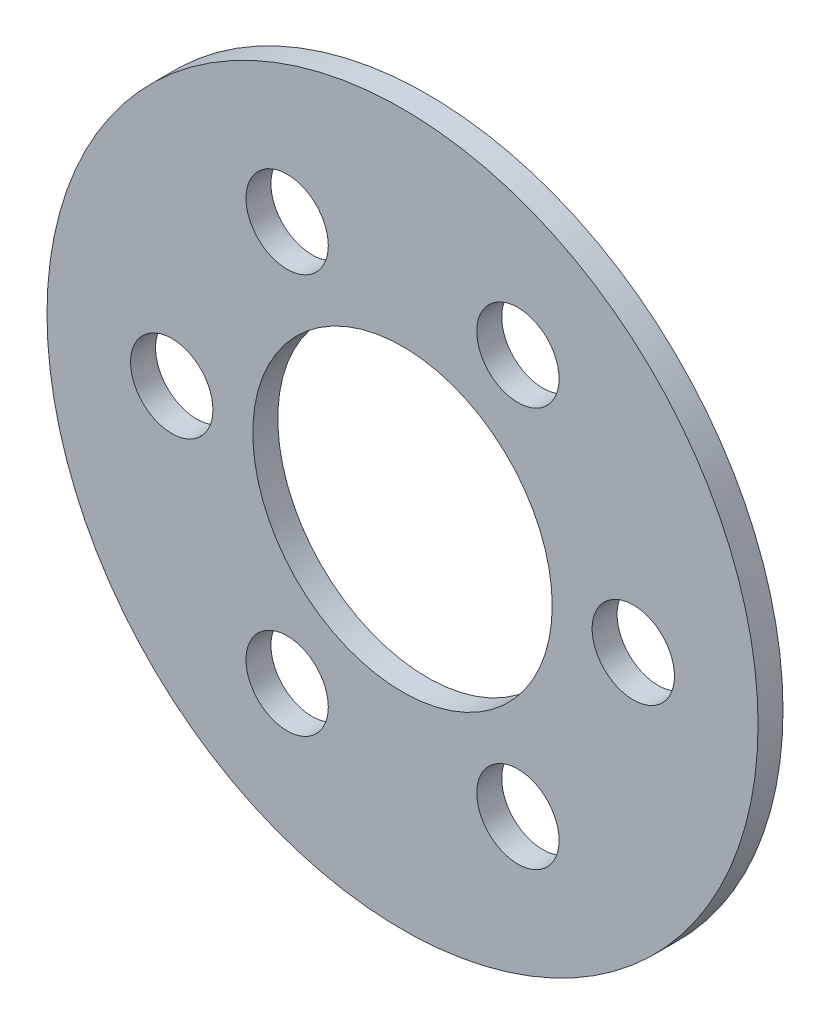
ISO-10303-21;
HEADER;
FILE_DESCRIPTION(('STEP AP214'),'2;1');
FILE_NAME('part.step','',(''),(''),'','','');
FILE_SCHEMA(('AUTOMOTIVE_DESIGN { 1 0 10303 214 1 1 1 1 }'));
ENDSEC;
DATA;
#1=APPLICATION_CONTEXT('core data for automotive mechanical design processes');
#2=APPLICATION_PROTOCOL_DEFINITION('international standard','automotive_design',2000,#1);
#3=PRODUCT_CONTEXT('',#1,'mechanical');
#4=PRODUCT('Part','Part','',(#3));
#5=PRODUCT_RELATED_PRODUCT_CATEGORY('part','',(#4));
#6=PRODUCT_DEFINITION_FORMATION('','',#4);
#7=PRODUCT_DEFINITION_CONTEXT('part definition',#1,'design');
#8=PRODUCT_DEFINITION('design','',#6,#7);
#9=PRODUCT_DEFINITION_SHAPE('','',#8);
#10=(LENGTH_UNIT() NAMED_UNIT(*) SI_UNIT(.MILLI.,.METRE.));
#11=(NAMED_UNIT(*) PLANE_ANGLE_UNIT() SI_UNIT($,.RADIAN.));
#12=(NAMED_UNIT(*) SI_UNIT($,.STERADIAN.) SOLID_ANGLE_UNIT());
#13=UNCERTAINTY_MEASURE_WITH_UNIT(LENGTH_MEASURE(1.E-05),#10,'distance_accuracy_value','');
#14=(GEOMETRIC_REPRESENTATION_CONTEXT(3) GLOBAL_UNCERTAINTY_ASSIGNED_CONTEXT((#13)) GLOBAL_UNIT_ASSIGNED_CONTEXT((#10,
#11,#12)) REPRESENTATION_CONTEXT('',''));
#15=CARTESIAN_POINT('',(0.,0.,0.));
#16=DIRECTION('',(0.,0.,1.));
#17=DIRECTION('',(1.,0.,0.));
#18=AXIS2_PLACEMENT_3D('',#15,#16,#17);
#19=CARTESIAN_POINT('',(0.,0.,1.));
#20=DIRECTION('',(0.,0.,-1.));
#21=DIRECTION('',(-1.,0.,0.));
#22=AXIS2_PLACEMENT_3D('',#19,#20,#21);
#23=CYLINDRICAL_SURFACE('',#22,6.);
#24=CARTESIAN_POINT('',(0.,0.,1.));
#25=DIRECTION('',(0.,0.,1.));
#26=DIRECTION('',(1.,0.,0.));
#27=AXIS2_PLACEMENT_3D('',#24,#25,#26);
#28=CIRCLE('',#27,6.);
#29=CARTESIAN_POINT('',(6.,0.,1.));
#30=VERTEX_POINT('',#29);
#31=EDGE_CURVE('E47',#30,#30,#28,.T.);
#32=ORIENTED_EDGE('',*,*,#31,.T.);
#33=EDGE_LOOP('',(#32));
#34=FACE_BOUND('',#33,.T.);
#35=CARTESIAN_POINT('',(0.,0.,0.));
#36=DIRECTION('',(0.,0.,1.));
#37=DIRECTION('',(1.,0.,0.));
#38=AXIS2_PLACEMENT_3D('',#35,#36,#37);
#39=CIRCLE('',#38,6.);
#40=CARTESIAN_POINT('',(6.,0.,0.));
#41=VERTEX_POINT('',#40);
#42=EDGE_CURVE('E73',#41,#41,#39,.T.);
#43=ORIENTED_EDGE('',*,*,#42,.F.);
#44=EDGE_LOOP('',(#43));
#45=FACE_BOUND('',#44,.T.);
#46=ADVANCED_FACE('F39',(#34,#45),#23,.F.);
#47=CARTESIAN_POINT('',(-4.625,8.01073498500606,1.));
#48=DIRECTION('',(0.,0.,-1.));
#49=DIRECTION('',(-1.,0.,0.));
#50=AXIS2_PLACEMENT_3D('',#47,#48,#49);
#51=CYLINDRICAL_SURFACE('',#50,1.65);
#52=CARTESIAN_POINT('',(-4.625,8.01073498500606,1.));
#53=DIRECTION('',(0.,0.,1.));
#54=DIRECTION('',(1.,0.,0.));
#55=AXIS2_PLACEMENT_3D('',#52,#53,#54);
#56=CIRCLE('',#55,1.65);
#57=CARTESIAN_POINT('',(-2.975,8.01073498500606,1.));
#58=VERTEX_POINT('',#57);
#59=EDGE_CURVE('E52',#58,#58,#56,.T.);
#60=ORIENTED_EDGE('',*,*,#59,.T.);
#61=EDGE_LOOP('',(#60));
#62=FACE_BOUND('',#61,.T.);
#63=CARTESIAN_POINT('',(-4.625,8.01073498500606,0.));
#64=DIRECTION('',(0.,0.,1.));
#65=DIRECTION('',(1.,0.,0.));
#66=AXIS2_PLACEMENT_3D('',#63,#64,#65);
#67=CIRCLE('',#66,1.65);
#68=CARTESIAN_POINT('',(-2.975,8.01073498500606,0.));
#69=VERTEX_POINT('',#68);
#70=EDGE_CURVE('E71',#69,#69,#67,.T.);
#71=ORIENTED_EDGE('',*,*,#70,.F.);
#72=EDGE_LOOP('',(#71));
#73=FACE_BOUND('',#72,.T.);
#74=ADVANCED_FACE('F100',(#62,#73),#51,.F.);
#75=CARTESIAN_POINT('',(4.625,8.01073498500606,1.));
#76=DIRECTION('',(0.,0.,-1.));
#77=DIRECTION('',(-1.,0.,0.));
#78=AXIS2_PLACEMENT_3D('',#75,#76,#77);
#79=CYLINDRICAL_SURFACE('',#78,1.65);
#80=CARTESIAN_POINT('',(4.625,8.01073498500606,1.));
#81=DIRECTION('',(0.,0.,1.));
#82=DIRECTION('',(1.,0.,0.));
#83=AXIS2_PLACEMENT_3D('',#80,#81,#82);
#84=CIRCLE('',#83,1.65);
#85=CARTESIAN_POINT('',(6.275,8.01073498500606,1.));
#86=VERTEX_POINT('',#85);
#87=EDGE_CURVE('E95',#86,#86,#84,.T.);
#88=ORIENTED_EDGE('',*,*,#87,.T.);
#89=EDGE_LOOP('',(#88));
#90=FACE_BOUND('',#89,.T.);
#91=CARTESIAN_POINT('',(4.625,8.01073498500606,0.));
#92=DIRECTION('',(0.,0.,1.));
#93=DIRECTION('',(1.,0.,0.));
#94=AXIS2_PLACEMENT_3D('',#91,#92,#93);
#95=CIRCLE('',#94,1.65);
#96=CARTESIAN_POINT('',(6.275,8.01073498500606,0.));
#97=VERTEX_POINT('',#96);
#98=EDGE_CURVE('E68',#97,#97,#95,.T.);
#99=ORIENTED_EDGE('',*,*,#98,.F.);
#100=EDGE_LOOP('',(#99));
#101=FACE_BOUND('',#100,.T.);
#102=ADVANCED_FACE('F118',(#90,#101),#79,.F.);
#103=CARTESIAN_POINT('',(9.25,0.,1.));
#104=DIRECTION('',(0.,0.,-1.));
#105=DIRECTION('',(-1.,0.,0.));
#106=AXIS2_PLACEMENT_3D('',#103,#104,#105);
#107=CYLINDRICAL_SURFACE('',#106,1.65);
#108=CARTESIAN_POINT('',(9.25,0.,1.));
#109=DIRECTION('',(0.,0.,1.));
#110=DIRECTION('',(1.,0.,0.));
#111=AXIS2_PLACEMENT_3D('',#108,#109,#110);
#112=CIRCLE('',#111,1.65);
#113=CARTESIAN_POINT('',(10.9,0.,1.));
#114=VERTEX_POINT('',#113);
#115=EDGE_CURVE('E92',#114,#114,#112,.T.);
#116=ORIENTED_EDGE('',*,*,#115,.T.);
#117=EDGE_LOOP('',(#116));
#118=FACE_BOUND('',#117,.T.);
#119=CARTESIAN_POINT('',(9.25,0.,0.));
#120=DIRECTION('',(0.,0.,1.));
#121=DIRECTION('',(1.,0.,0.));
#122=AXIS2_PLACEMENT_3D('',#119,#120,#121);
#123=CIRCLE('',#122,1.65);
#124=CARTESIAN_POINT('',(10.9,0.,0.));
#125=VERTEX_POINT('',#124);
#126=EDGE_CURVE('E65',#125,#125,#123,.T.);
#127=ORIENTED_EDGE('',*,*,#126,.F.);
#128=EDGE_LOOP('',(#127));
#129=FACE_BOUND('',#128,.T.);
#130=ADVANCED_FACE('F125',(#118,#129),#107,.F.);
#131=CARTESIAN_POINT('',(4.62500000000001,-8.01073498500606,1.));
#132=DIRECTION('',(0.,0.,-1.));
#133=DIRECTION('',(-1.,0.,0.));
#134=AXIS2_PLACEMENT_3D('',#131,#132,#133);
#135=CYLINDRICAL_SURFACE('',#134,1.65);
#136=CARTESIAN_POINT('',(4.62500000000001,-8.01073498500606,1.));
#137=DIRECTION('',(0.,0.,1.));
#138=DIRECTION('',(1.,0.,0.));
#139=AXIS2_PLACEMENT_3D('',#136,#137,#138);
#140=CIRCLE('',#139,1.65);
#141=CARTESIAN_POINT('',(6.27500000000001,-8.01073498500606,1.));
#142=VERTEX_POINT('',#141);
#143=EDGE_CURVE('E87',#142,#142,#140,.T.);
#144=ORIENTED_EDGE('',*,*,#143,.T.);
#145=EDGE_LOOP('',(#144));
#146=FACE_BOUND('',#145,.T.);
#147=CARTESIAN_POINT('',(4.62500000000001,-8.01073498500606,0.));
#148=DIRECTION('',(0.,0.,1.));
#149=DIRECTION('',(1.,0.,0.));
#150=AXIS2_PLACEMENT_3D('',#147,#148,#149);
#151=CIRCLE('',#150,1.65);
#152=CARTESIAN_POINT('',(6.27500000000001,-8.01073498500606,0.));
#153=VERTEX_POINT('',#152);
#154=EDGE_CURVE('E62',#153,#153,#151,.T.);
#155=ORIENTED_EDGE('',*,*,#154,.F.);
#156=EDGE_LOOP('',(#155));
#157=FACE_BOUND('',#156,.T.);
#158=ADVANCED_FACE('F129',(#146,#157),#135,.F.);
#159=CARTESIAN_POINT('',(-4.625,-8.01073498500606,1.));
#160=DIRECTION('',(0.,0.,-1.));
#161=DIRECTION('',(-1.,0.,0.));
#162=AXIS2_PLACEMENT_3D('',#159,#160,#161);
#163=CYLINDRICAL_SURFACE('',#162,1.65);
#164=CARTESIAN_POINT('',(-4.625,-8.01073498500606,1.));
#165=DIRECTION('',(0.,0.,1.));
#166=DIRECTION('',(1.,0.,0.));
#167=AXIS2_PLACEMENT_3D('',#164,#165,#166);
#168=CIRCLE('',#167,1.65);
#169=CARTESIAN_POINT('',(-2.975,-8.01073498500606,1.));
#170=VERTEX_POINT('',#169);
#171=EDGE_CURVE('E82',#170,#170,#168,.T.);
#172=ORIENTED_EDGE('',*,*,#171,.T.);
#173=EDGE_LOOP('',(#172));
#174=FACE_BOUND('',#173,.T.);
#175=CARTESIAN_POINT('',(-4.625,-8.01073498500606,0.));
#176=DIRECTION('',(0.,0.,1.));
#177=DIRECTION('',(1.,0.,0.));
#178=AXIS2_PLACEMENT_3D('',#175,#176,#177);
#179=CIRCLE('',#178,1.65);
#180=CARTESIAN_POINT('',(-2.975,-8.01073498500606,0.));
#181=VERTEX_POINT('',#180);
#182=EDGE_CURVE('E59',#181,#181,#179,.T.);
#183=ORIENTED_EDGE('',*,*,#182,.F.);
#184=EDGE_LOOP('',(#183));
#185=FACE_BOUND('',#184,.T.);
#186=ADVANCED_FACE('F132',(#174,#185),#163,.F.);
#187=CARTESIAN_POINT('',(-9.25,0.,1.));
#188=DIRECTION('',(0.,0.,-1.));
#189=DIRECTION('',(-1.,0.,0.));
#190=AXIS2_PLACEMENT_3D('',#187,#188,#189);
#191=CYLINDRICAL_SURFACE('',#190,1.65);
#192=CARTESIAN_POINT('',(-9.25,0.,1.));
#193=DIRECTION('',(0.,0.,1.));
#194=DIRECTION('',(1.,0.,0.));
#195=AXIS2_PLACEMENT_3D('',#192,#193,#194);
#196=CIRCLE('',#195,1.65);
#197=CARTESIAN_POINT('',(-7.6,0.,1.));
#198=VERTEX_POINT('',#197);
#199=EDGE_CURVE('E78',#198,#198,#196,.T.);
#200=ORIENTED_EDGE('',*,*,#199,.T.);
#201=EDGE_LOOP('',(#200));
#202=FACE_BOUND('',#201,.T.);
#203=CARTESIAN_POINT('',(-9.25,0.,0.));
#204=DIRECTION('',(0.,0.,1.));
#205=DIRECTION('',(1.,0.,0.));
#206=AXIS2_PLACEMENT_3D('',#203,#204,#205);
#207=CIRCLE('',#206,1.65);
#208=CARTESIAN_POINT('',(-7.6,0.,0.));
#209=VERTEX_POINT('',#208);
#210=EDGE_CURVE('E56',#209,#209,#207,.T.);
#211=ORIENTED_EDGE('',*,*,#210,.F.);
#212=EDGE_LOOP('',(#211));
#213=FACE_BOUND('',#212,.T.);
#214=ADVANCED_FACE('F41',(#202,#213),#191,.F.);
#215=CARTESIAN_POINT('',(0.,0.,1.));
#216=DIRECTION('',(0.,0.,-1.));
#217=DIRECTION('',(-1.,0.,0.));
#218=AXIS2_PLACEMENT_3D('',#215,#216,#217);
#219=CYLINDRICAL_SURFACE('',#218,14.25);
#220=CARTESIAN_POINT('',(0.,0.,1.));
#221=DIRECTION('',(0.,0.,1.));
#222=DIRECTION('',(1.,0.,0.));
#223=AXIS2_PLACEMENT_3D('',#220,#221,#222);
#224=CIRCLE('',#223,14.25);
#225=CARTESIAN_POINT('',(14.25,0.,1.));
#226=VERTEX_POINT('',#225);
#227=EDGE_CURVE('E10',#226,#226,#224,.T.);
#228=ORIENTED_EDGE('',*,*,#227,.F.);
#229=EDGE_LOOP('',(#228));
#230=FACE_BOUND('',#229,.T.);
#231=CARTESIAN_POINT('',(0.,0.,0.));
#232=DIRECTION('',(0.,0.,1.));
#233=DIRECTION('',(1.,0.,0.));
#234=AXIS2_PLACEMENT_3D('',#231,#232,#233);
#235=CIRCLE('',#234,14.25);
#236=CARTESIAN_POINT('',(14.25,0.,0.));
#237=VERTEX_POINT('',#236);
#238=EDGE_CURVE('E43',#237,#237,#235,.T.);
#239=ORIENTED_EDGE('',*,*,#238,.T.);
#240=EDGE_LOOP('',(#239));
#241=FACE_BOUND('',#240,.T.);
#242=ADVANCED_FACE('F107',(#230,#241),#219,.T.);
#243=CARTESIAN_POINT('',(0.,0.,1.));
#244=DIRECTION('',(0.,0.,1.));
#245=DIRECTION('',(1.,0.,0.));
#246=AXIS2_PLACEMENT_3D('',#243,#244,#245);
#247=PLANE('',#246);
#248=ORIENTED_EDGE('',*,*,#199,.F.);
#249=EDGE_LOOP('',(#248));
#250=FACE_BOUND('',#249,.T.);
#251=ORIENTED_EDGE('',*,*,#171,.F.);
#252=EDGE_LOOP('',(#251));
#253=FACE_BOUND('',#252,.T.);
#254=ORIENTED_EDGE('',*,*,#143,.F.);
#255=EDGE_LOOP('',(#254));
#256=FACE_BOUND('',#255,.T.);
#257=ORIENTED_EDGE('',*,*,#115,.F.);
#258=EDGE_LOOP('',(#257));
#259=FACE_BOUND('',#258,.T.);
#260=ORIENTED_EDGE('',*,*,#87,.F.);
#261=EDGE_LOOP('',(#260));
#262=FACE_BOUND('',#261,.T.);
#263=ORIENTED_EDGE('',*,*,#59,.F.);
#264=EDGE_LOOP('',(#263));
#265=FACE_BOUND('',#264,.T.);
#266=ORIENTED_EDGE('',*,*,#31,.F.);
#267=EDGE_LOOP('',(#266));
#268=FACE_BOUND('',#267,.T.);
#269=ORIENTED_EDGE('',*,*,#227,.T.);
#270=EDGE_LOOP('',(#269));
#271=FACE_BOUND('',#270,.T.);
#272=ADVANCED_FACE('F103',(#250,#253,#256,#259,#262,#265,#268,#271),#247,.T.);
#273=CARTESIAN_POINT('',(0.,0.,0.));
#274=DIRECTION('',(0.,0.,1.));
#275=DIRECTION('',(1.,0.,0.));
#276=AXIS2_PLACEMENT_3D('',#273,#274,#275);
#277=PLANE('',#276);
#278=ORIENTED_EDGE('',*,*,#210,.T.);
#279=EDGE_LOOP('',(#278));
#280=FACE_BOUND('',#279,.T.);
#281=ORIENTED_EDGE('',*,*,#182,.T.);
#282=EDGE_LOOP('',(#281));
#283=FACE_BOUND('',#282,.T.);
#284=ORIENTED_EDGE('',*,*,#154,.T.);
#285=EDGE_LOOP('',(#284));
#286=FACE_BOUND('',#285,.T.);
#287=ORIENTED_EDGE('',*,*,#126,.T.);
#288=EDGE_LOOP('',(#287));
#289=FACE_BOUND('',#288,.T.);
#290=ORIENTED_EDGE('',*,*,#98,.T.);
#291=EDGE_LOOP('',(#290));
#292=FACE_BOUND('',#291,.T.);
#293=ORIENTED_EDGE('',*,*,#70,.T.);
#294=EDGE_LOOP('',(#293));
#295=FACE_BOUND('',#294,.T.);
#296=ORIENTED_EDGE('',*,*,#42,.T.);
#297=EDGE_LOOP('',(#296));
#298=FACE_BOUND('',#297,.T.);
#299=ORIENTED_EDGE('',*,*,#238,.F.);
#300=EDGE_LOOP('',(#299));
#301=FACE_BOUND('',#300,.T.);
#302=ADVANCED_FACE('F106',(#280,#283,#286,#289,#292,#295,#298,#301),#277,.F.);
#303=CLOSED_SHELL('',(#46,#74,#102,#130,#158,#186,#214,#242,#272,#302));
#304=MANIFOLD_SOLID_BREP('B2',#303);
#305=ADVANCED_BREP_SHAPE_REPRESENTATION('',(#18,#304),#14);
#306=SHAPE_DEFINITION_REPRESENTATION(#9,#305);
ENDSEC;
END-ISO-10303-21;
